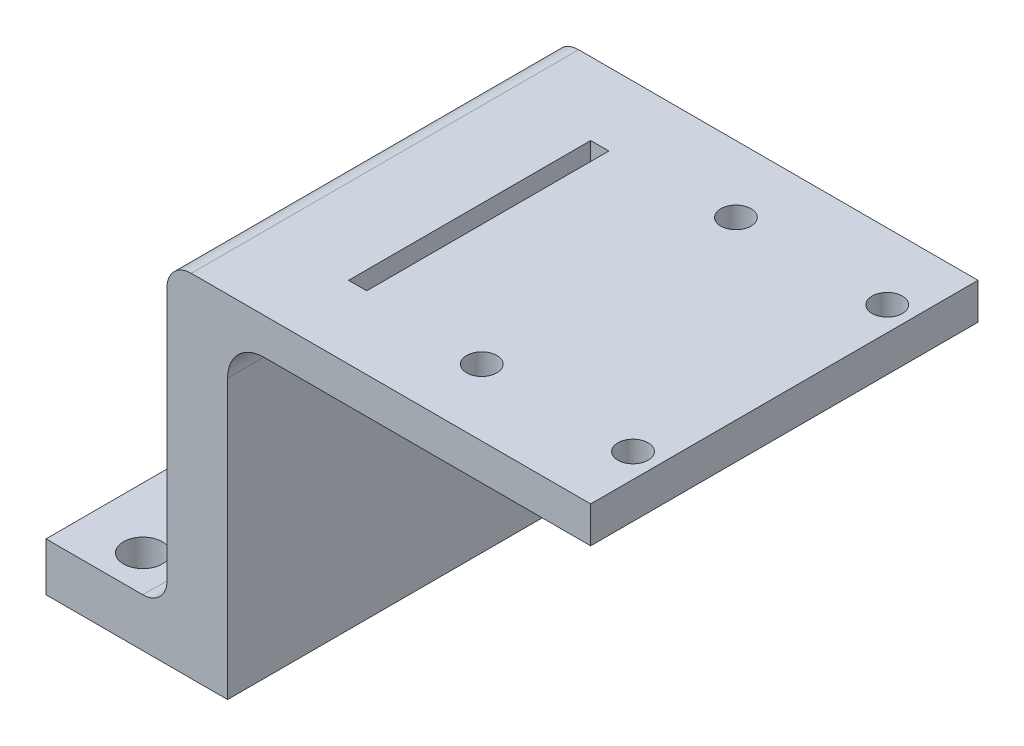
ISO-10303-21;
HEADER;
FILE_DESCRIPTION(('STEP AP214'),'2;1');
FILE_NAME('part.step','',(''),(''),'','','');
FILE_SCHEMA(('AUTOMOTIVE_DESIGN { 1 0 10303 214 1 1 1 1 }'));
ENDSEC;
DATA;
#1=APPLICATION_CONTEXT('core data for automotive mechanical design processes');
#2=APPLICATION_PROTOCOL_DEFINITION('international standard','automotive_design',2000,#1);
#3=PRODUCT_CONTEXT('',#1,'mechanical');
#4=PRODUCT('Part','Part','',(#3));
#5=PRODUCT_RELATED_PRODUCT_CATEGORY('part','',(#4));
#6=PRODUCT_DEFINITION_FORMATION('','',#4);
#7=PRODUCT_DEFINITION_CONTEXT('part definition',#1,'design');
#8=PRODUCT_DEFINITION('design','',#6,#7);
#9=PRODUCT_DEFINITION_SHAPE('','',#8);
#10=(LENGTH_UNIT() NAMED_UNIT(*) SI_UNIT(.MILLI.,.METRE.));
#11=(NAMED_UNIT(*) PLANE_ANGLE_UNIT() SI_UNIT($,.RADIAN.));
#12=(NAMED_UNIT(*) SI_UNIT($,.STERADIAN.) SOLID_ANGLE_UNIT());
#13=UNCERTAINTY_MEASURE_WITH_UNIT(LENGTH_MEASURE(1.E-05),#10,'distance_accuracy_value','');
#14=(GEOMETRIC_REPRESENTATION_CONTEXT(3) GLOBAL_UNCERTAINTY_ASSIGNED_CONTEXT((#13)) GLOBAL_UNIT_ASSIGNED_CONTEXT((#10,
#11,#12)) REPRESENTATION_CONTEXT('',''));
#15=CARTESIAN_POINT('',(0.,0.,0.));
#16=DIRECTION('',(0.,0.,1.));
#17=DIRECTION('',(1.,0.,0.));
#18=AXIS2_PLACEMENT_3D('',#15,#16,#17);
#19=CARTESIAN_POINT('',(0.,4.,0.));
#20=DIRECTION('',(0.,1.,0.));
#21=DIRECTION('',(0.,0.,1.));
#22=AXIS2_PLACEMENT_3D('',#19,#20,#21);
#23=PLANE('',#22);
#24=DIRECTION('',(1.,0.,0.));
#25=VECTOR('',#24,1.);
#26=CARTESIAN_POINT('',(-5.,4.,16.));
#27=LINE('',#26,#25);
#28=CARTESIAN_POINT('',(-5.,4.,16.));
#29=VERTEX_POINT('',#28);
#30=CARTESIAN_POINT('',(3.,4.,16.));
#31=VERTEX_POINT('',#30);
#32=EDGE_CURVE('E250',#29,#31,#27,.T.);
#33=ORIENTED_EDGE('',*,*,#32,.T.);
#34=DIRECTION('',(0.,0.,1.));
#35=VECTOR('',#34,1.);
#36=CARTESIAN_POINT('',(3.,4.,0.));
#37=LINE('',#36,#35);
#38=CARTESIAN_POINT('',(3.,4.,-16.));
#39=VERTEX_POINT('',#38);
#40=EDGE_CURVE('E267',#31,#39,#37,.F.);
#41=ORIENTED_EDGE('',*,*,#40,.T.);
#42=DIRECTION('',(-1.,0.,0.));
#43=VECTOR('',#42,1.);
#44=CARTESIAN_POINT('',(-5.,4.,-16.));
#45=LINE('',#44,#43);
#46=CARTESIAN_POINT('',(-5.,4.,-16.));
#47=VERTEX_POINT('',#46);
#48=EDGE_CURVE('E245',#39,#47,#45,.T.);
#49=ORIENTED_EDGE('',*,*,#48,.T.);
#50=DIRECTION('',(0.,0.,1.));
#51=VECTOR('',#50,1.);
#52=CARTESIAN_POINT('',(-5.,4.,-16.));
#53=LINE('',#52,#51);
#54=EDGE_CURVE('E247',#47,#29,#53,.T.);
#55=ORIENTED_EDGE('',*,*,#54,.T.);
#56=EDGE_LOOP('',(#33,#41,#49,#55));
#57=FACE_BOUND('',#56,.T.);
#58=CARTESIAN_POINT('',(0.,4.,13.));
#59=DIRECTION('',(0.,1.,0.));
#60=DIRECTION('',(0.,0.,1.));
#61=AXIS2_PLACEMENT_3D('',#58,#59,#60);
#62=CIRCLE('',#61,1.6);
#63=CARTESIAN_POINT('',(0.,4.,14.6));
#64=VERTEX_POINT('',#63);
#65=EDGE_CURVE('E239',#64,#64,#62,.T.);
#66=ORIENTED_EDGE('',*,*,#65,.F.);
#67=EDGE_LOOP('',(#66));
#68=FACE_BOUND('',#67,.T.);
#69=CARTESIAN_POINT('',(0.,4.,-13.));
#70=DIRECTION('',(0.,1.,0.));
#71=DIRECTION('',(0.,0.,1.));
#72=AXIS2_PLACEMENT_3D('',#69,#70,#71);
#73=CIRCLE('',#72,1.6);
#74=CARTESIAN_POINT('',(0.,4.,-11.4));
#75=VERTEX_POINT('',#74);
#76=EDGE_CURVE('E233',#75,#75,#73,.T.);
#77=ORIENTED_EDGE('',*,*,#76,.F.);
#78=EDGE_LOOP('',(#77));
#79=FACE_BOUND('',#78,.T.);
#80=ADVANCED_FACE('F41',(#57,#68,#79),#23,.T.);
#81=CARTESIAN_POINT('',(0.,0.,0.));
#82=DIRECTION('',(0.,1.,0.));
#83=DIRECTION('',(0.,0.,1.));
#84=AXIS2_PLACEMENT_3D('',#81,#82,#83);
#85=PLANE('',#84);
#86=DIRECTION('',(-1.,0.,0.));
#87=VECTOR('',#86,1.);
#88=CARTESIAN_POINT('',(-5.,0.,-16.));
#89=LINE('',#88,#87);
#90=CARTESIAN_POINT('',(10.,0.,-16.));
#91=VERTEX_POINT('',#90);
#92=CARTESIAN_POINT('',(-5.,0.,-16.));
#93=VERTEX_POINT('',#92);
#94=EDGE_CURVE('E242',#91,#93,#89,.T.);
#95=ORIENTED_EDGE('',*,*,#94,.F.);
#96=DIRECTION('',(0.,0.,-1.));
#97=VECTOR('',#96,1.);
#98=CARTESIAN_POINT('',(10.,0.,16.));
#99=LINE('',#98,#97);
#100=CARTESIAN_POINT('',(10.,0.,16.));
#101=VERTEX_POINT('',#100);
#102=EDGE_CURVE('E226',#101,#91,#99,.T.);
#103=ORIENTED_EDGE('',*,*,#102,.F.);
#104=DIRECTION('',(1.,0.,0.));
#105=VECTOR('',#104,1.);
#106=CARTESIAN_POINT('',(-5.,0.,16.));
#107=LINE('',#106,#105);
#108=CARTESIAN_POINT('',(-5.,0.,16.));
#109=VERTEX_POINT('',#108);
#110=EDGE_CURVE('E248',#109,#101,#107,.T.);
#111=ORIENTED_EDGE('',*,*,#110,.F.);
#112=DIRECTION('',(0.,0.,1.));
#113=VECTOR('',#112,1.);
#114=CARTESIAN_POINT('',(-5.,0.,-16.));
#115=LINE('',#114,#113);
#116=EDGE_CURVE('E255',#93,#109,#115,.T.);
#117=ORIENTED_EDGE('',*,*,#116,.F.);
#118=EDGE_LOOP('',(#95,#103,#111,#117));
#119=FACE_BOUND('',#118,.T.);
#120=CARTESIAN_POINT('',(0.,0.,13.));
#121=DIRECTION('',(0.,1.,0.));
#122=DIRECTION('',(0.,0.,1.));
#123=AXIS2_PLACEMENT_3D('',#120,#121,#122);
#124=CIRCLE('',#123,1.6);
#125=CARTESIAN_POINT('',(0.,0.,14.6));
#126=VERTEX_POINT('',#125);
#127=EDGE_CURVE('E236',#126,#126,#124,.T.);
#128=ORIENTED_EDGE('',*,*,#127,.T.);
#129=EDGE_LOOP('',(#128));
#130=FACE_BOUND('',#129,.T.);
#131=CARTESIAN_POINT('',(0.,0.,-13.));
#132=DIRECTION('',(0.,1.,0.));
#133=DIRECTION('',(0.,0.,1.));
#134=AXIS2_PLACEMENT_3D('',#131,#132,#133);
#135=CIRCLE('',#134,1.6);
#136=CARTESIAN_POINT('',(0.,0.,-11.4));
#137=VERTEX_POINT('',#136);
#138=EDGE_CURVE('E232',#137,#137,#135,.T.);
#139=ORIENTED_EDGE('',*,*,#138,.T.);
#140=EDGE_LOOP('',(#139));
#141=FACE_BOUND('',#140,.T.);
#142=ADVANCED_FACE('F348',(#119,#130,#141),#85,.F.);
#143=CARTESIAN_POINT('',(-5.,4.,-16.));
#144=DIRECTION('',(0.,0.,1.));
#145=DIRECTION('',(1.,0.,0.));
#146=AXIS2_PLACEMENT_3D('',#143,#144,#145);
#147=PLANE('',#146);
#148=DIRECTION('',(0.,-1.,0.));
#149=VECTOR('',#148,1.);
#150=CARTESIAN_POINT('',(5.,29.,-16.));
#151=LINE('',#150,#149);
#152=CARTESIAN_POINT('',(5.,27.,-16.));
#153=VERTEX_POINT('',#152);
#154=CARTESIAN_POINT('',(5.,6.,-16.));
#155=VERTEX_POINT('',#154);
#156=EDGE_CURVE('E222',#153,#155,#151,.T.);
#157=ORIENTED_EDGE('',*,*,#156,.F.);
#158=CARTESIAN_POINT('',(7.,27.,-16.));
#159=DIRECTION('',(0.,0.,1.));
#160=DIRECTION('',(1.,0.,0.));
#161=AXIS2_PLACEMENT_3D('',#158,#159,#160);
#162=CIRCLE('',#161,2.);
#163=CARTESIAN_POINT('',(7.,29.,-16.));
#164=VERTEX_POINT('',#163);
#165=EDGE_CURVE('E291',#153,#164,#162,.F.);
#166=ORIENTED_EDGE('',*,*,#165,.T.);
#167=DIRECTION('',(-1.,0.,0.));
#168=VECTOR('',#167,1.);
#169=CARTESIAN_POINT('',(10.,29.,-16.));
#170=LINE('',#169,#168);
#171=CARTESIAN_POINT('',(40.,29.,-16.));
#172=VERTEX_POINT('',#171);
#173=EDGE_CURVE('E215',#172,#164,#170,.T.);
#174=ORIENTED_EDGE('',*,*,#173,.F.);
#175=DIRECTION('',(0.,1.,0.));
#176=VECTOR('',#175,1.);
#177=CARTESIAN_POINT('',(40.,29.,-16.));
#178=LINE('',#177,#176);
#179=CARTESIAN_POINT('',(40.,26.,-16.));
#180=VERTEX_POINT('',#179);
#181=EDGE_CURVE('E203',#180,#172,#178,.T.);
#182=ORIENTED_EDGE('',*,*,#181,.F.);
#183=DIRECTION('',(-1.,0.,0.));
#184=VECTOR('',#183,1.);
#185=CARTESIAN_POINT('',(40.,26.,-16.));
#186=LINE('',#185,#184);
#187=CARTESIAN_POINT('',(13.,26.,-16.));
#188=VERTEX_POINT('',#187);
#189=EDGE_CURVE('E209',#180,#188,#186,.T.);
#190=ORIENTED_EDGE('',*,*,#189,.T.);
#191=CARTESIAN_POINT('',(13.,23.,-16.));
#192=DIRECTION('',(0.,0.,1.));
#193=DIRECTION('',(1.,0.,0.));
#194=AXIS2_PLACEMENT_3D('',#191,#192,#193);
#195=CIRCLE('',#194,3.);
#196=CARTESIAN_POINT('',(10.,23.,-16.));
#197=VERTEX_POINT('',#196);
#198=EDGE_CURVE('E49',#188,#197,#195,.T.);
#199=ORIENTED_EDGE('',*,*,#198,.T.);
#200=DIRECTION('',(0.,1.,0.));
#201=VECTOR('',#200,1.);
#202=CARTESIAN_POINT('',(10.,4.,-16.));
#203=LINE('',#202,#201);
#204=EDGE_CURVE('E229',#91,#197,#203,.T.);
#205=ORIENTED_EDGE('',*,*,#204,.F.);
#206=ORIENTED_EDGE('',*,*,#94,.T.);
#207=DIRECTION('',(0.,-1.,0.));
#208=VECTOR('',#207,1.);
#209=CARTESIAN_POINT('',(-5.,4.,-16.));
#210=LINE('',#209,#208);
#211=EDGE_CURVE('E261',#47,#93,#210,.T.);
#212=ORIENTED_EDGE('',*,*,#211,.F.);
#213=ORIENTED_EDGE('',*,*,#48,.F.);
#214=CARTESIAN_POINT('',(3.,6.,-16.));
#215=DIRECTION('',(0.,0.,1.));
#216=DIRECTION('',(1.,0.,0.));
#217=AXIS2_PLACEMENT_3D('',#214,#215,#216);
#218=CIRCLE('',#217,2.);
#219=EDGE_CURVE('E271',#39,#155,#218,.T.);
#220=ORIENTED_EDGE('',*,*,#219,.T.);
#221=EDGE_LOOP('',(#157,#166,#174,#182,#190,#199,#205,#206,#212,#213,#220));
#222=FACE_BOUND('',#221,.T.);
#223=ADVANCED_FACE('F300',(#222),#147,.F.);
#224=CARTESIAN_POINT('',(-5.,4.,-16.));
#225=DIRECTION('',(1.,0.,0.));
#226=DIRECTION('',(0.,0.,-1.));
#227=AXIS2_PLACEMENT_3D('',#224,#225,#226);
#228=PLANE('',#227);
#229=ORIENTED_EDGE('',*,*,#116,.T.);
#230=DIRECTION('',(0.,-1.,0.));
#231=VECTOR('',#230,1.);
#232=CARTESIAN_POINT('',(-5.,4.,16.));
#233=LINE('',#232,#231);
#234=EDGE_CURVE('E253',#29,#109,#233,.T.);
#235=ORIENTED_EDGE('',*,*,#234,.F.);
#236=ORIENTED_EDGE('',*,*,#54,.F.);
#237=ORIENTED_EDGE('',*,*,#211,.T.);
#238=EDGE_LOOP('',(#229,#235,#236,#237));
#239=FACE_BOUND('',#238,.T.);
#240=ADVANCED_FACE('F344',(#239),#228,.F.);
#241=CARTESIAN_POINT('',(-5.,4.,16.));
#242=DIRECTION('',(0.,0.,-1.));
#243=DIRECTION('',(-1.,0.,0.));
#244=AXIS2_PLACEMENT_3D('',#241,#242,#243);
#245=PLANE('',#244);
#246=DIRECTION('',(1.,0.,0.));
#247=VECTOR('',#246,1.);
#248=CARTESIAN_POINT('',(10.,29.,16.));
#249=LINE('',#248,#247);
#250=CARTESIAN_POINT('',(7.,29.,16.));
#251=VERTEX_POINT('',#250);
#252=CARTESIAN_POINT('',(40.,29.,16.));
#253=VERTEX_POINT('',#252);
#254=EDGE_CURVE('E218',#251,#253,#249,.T.);
#255=ORIENTED_EDGE('',*,*,#254,.F.);
#256=CARTESIAN_POINT('',(7.,27.,16.));
#257=DIRECTION('',(0.,0.,-1.));
#258=DIRECTION('',(-1.,0.,0.));
#259=AXIS2_PLACEMENT_3D('',#256,#257,#258);
#260=CIRCLE('',#259,2.);
#261=CARTESIAN_POINT('',(5.,27.,16.));
#262=VERTEX_POINT('',#261);
#263=EDGE_CURVE('E287',#251,#262,#260,.F.);
#264=ORIENTED_EDGE('',*,*,#263,.T.);
#265=DIRECTION('',(0.,-1.,0.));
#266=VECTOR('',#265,1.);
#267=CARTESIAN_POINT('',(5.,29.,16.));
#268=LINE('',#267,#266);
#269=CARTESIAN_POINT('',(5.,6.,16.));
#270=VERTEX_POINT('',#269);
#271=EDGE_CURVE('E220',#262,#270,#268,.T.);
#272=ORIENTED_EDGE('',*,*,#271,.T.);
#273=CARTESIAN_POINT('',(3.,6.,16.));
#274=DIRECTION('',(0.,0.,-1.));
#275=DIRECTION('',(-1.,0.,0.));
#276=AXIS2_PLACEMENT_3D('',#273,#274,#275);
#277=CIRCLE('',#276,2.);
#278=EDGE_CURVE('E269',#270,#31,#277,.T.);
#279=ORIENTED_EDGE('',*,*,#278,.T.);
#280=ORIENTED_EDGE('',*,*,#32,.F.);
#281=ORIENTED_EDGE('',*,*,#234,.T.);
#282=ORIENTED_EDGE('',*,*,#110,.T.);
#283=DIRECTION('',(0.,-1.,0.));
#284=VECTOR('',#283,1.);
#285=CARTESIAN_POINT('',(10.,4.,16.));
#286=LINE('',#285,#284);
#287=CARTESIAN_POINT('',(10.,23.,16.));
#288=VERTEX_POINT('',#287);
#289=EDGE_CURVE('E224',#288,#101,#286,.T.);
#290=ORIENTED_EDGE('',*,*,#289,.F.);
#291=CARTESIAN_POINT('',(13.,23.,16.));
#292=DIRECTION('',(0.,0.,-1.));
#293=DIRECTION('',(-1.,0.,0.));
#294=AXIS2_PLACEMENT_3D('',#291,#292,#293);
#295=CIRCLE('',#294,3.);
#296=CARTESIAN_POINT('',(13.,26.,16.));
#297=VERTEX_POINT('',#296);
#298=EDGE_CURVE('E11',#288,#297,#295,.T.);
#299=ORIENTED_EDGE('',*,*,#298,.T.);
#300=DIRECTION('',(-1.,0.,0.));
#301=VECTOR('',#300,1.);
#302=CARTESIAN_POINT('',(40.,26.,16.));
#303=LINE('',#302,#301);
#304=CARTESIAN_POINT('',(40.,26.,16.));
#305=VERTEX_POINT('',#304);
#306=EDGE_CURVE('E212',#305,#297,#303,.T.);
#307=ORIENTED_EDGE('',*,*,#306,.F.);
#308=DIRECTION('',(0.,-1.,0.));
#309=VECTOR('',#308,1.);
#310=CARTESIAN_POINT('',(40.,29.,16.));
#311=LINE('',#310,#309);
#312=EDGE_CURVE('E197',#253,#305,#311,.T.);
#313=ORIENTED_EDGE('',*,*,#312,.F.);
#314=EDGE_LOOP('',(#255,#264,#272,#279,#280,#281,#282,#290,#299,#307,#313));
#315=FACE_BOUND('',#314,.T.);
#316=ADVANCED_FACE('F314',(#315),#245,.F.);
#317=CARTESIAN_POINT('',(0.,4.,13.));
#318=DIRECTION('',(0.,-1.,0.));
#319=DIRECTION('',(0.,0.,-1.));
#320=AXIS2_PLACEMENT_3D('',#317,#318,#319);
#321=CYLINDRICAL_SURFACE('',#320,1.6);
#322=ORIENTED_EDGE('',*,*,#65,.T.);
#323=EDGE_LOOP('',(#322));
#324=FACE_BOUND('',#323,.T.);
#325=ORIENTED_EDGE('',*,*,#127,.F.);
#326=EDGE_LOOP('',(#325));
#327=FACE_BOUND('',#326,.T.);
#328=ADVANCED_FACE('F358',(#324,#327),#321,.F.);
#329=CARTESIAN_POINT('',(0.,4.,-13.));
#330=DIRECTION('',(0.,-1.,0.));
#331=DIRECTION('',(0.,0.,-1.));
#332=AXIS2_PLACEMENT_3D('',#329,#330,#331);
#333=CYLINDRICAL_SURFACE('',#332,1.6);
#334=ORIENTED_EDGE('',*,*,#76,.T.);
#335=EDGE_LOOP('',(#334));
#336=FACE_BOUND('',#335,.T.);
#337=ORIENTED_EDGE('',*,*,#138,.F.);
#338=EDGE_LOOP('',(#337));
#339=FACE_BOUND('',#338,.T.);
#340=ADVANCED_FACE('F356',(#336,#339),#333,.F.);
#341=CARTESIAN_POINT('',(10.,0.,0.));
#342=DIRECTION('',(1.,0.,0.));
#343=DIRECTION('',(0.,0.,-1.));
#344=AXIS2_PLACEMENT_3D('',#341,#342,#343);
#345=PLANE('',#344);
#346=ORIENTED_EDGE('',*,*,#204,.T.);
#347=DIRECTION('',(0.,0.,-1.));
#348=VECTOR('',#347,1.);
#349=CARTESIAN_POINT('',(10.,23.,0.));
#350=LINE('',#349,#348);
#351=EDGE_CURVE('E296',#197,#288,#350,.F.);
#352=ORIENTED_EDGE('',*,*,#351,.T.);
#353=ORIENTED_EDGE('',*,*,#289,.T.);
#354=ORIENTED_EDGE('',*,*,#102,.T.);
#355=EDGE_LOOP('',(#346,#352,#353,#354));
#356=FACE_BOUND('',#355,.T.);
#357=ADVANCED_FACE('F307',(#356),#345,.T.);
#358=CARTESIAN_POINT('',(5.,29.,-16.));
#359=DIRECTION('',(1.,0.,0.));
#360=DIRECTION('',(0.,0.,-1.));
#361=AXIS2_PLACEMENT_3D('',#358,#359,#360);
#362=PLANE('',#361);
#363=ORIENTED_EDGE('',*,*,#271,.F.);
#364=DIRECTION('',(0.,0.,1.));
#365=VECTOR('',#364,1.);
#366=CARTESIAN_POINT('',(5.,27.,-16.));
#367=LINE('',#366,#365);
#368=EDGE_CURVE('E289',#262,#153,#367,.F.);
#369=ORIENTED_EDGE('',*,*,#368,.T.);
#370=ORIENTED_EDGE('',*,*,#156,.T.);
#371=DIRECTION('',(0.,0.,1.));
#372=VECTOR('',#371,1.);
#373=CARTESIAN_POINT('',(5.,6.,-16.));
#374=LINE('',#373,#372);
#375=EDGE_CURVE('E264',#155,#270,#374,.T.);
#376=ORIENTED_EDGE('',*,*,#375,.T.);
#377=EDGE_LOOP('',(#363,#369,#370,#376));
#378=FACE_BOUND('',#377,.T.);
#379=ADVANCED_FACE('F329',(#378),#362,.F.);
#380=CARTESIAN_POINT('',(0.,29.,0.));
#381=DIRECTION('',(0.,-1.,0.));
#382=DIRECTION('',(0.,0.,-1.));
#383=AXIS2_PLACEMENT_3D('',#380,#381,#382);
#384=PLANE('',#383);
#385=DIRECTION('',(1.,0.,0.));
#386=VECTOR('',#385,1.);
#387=CARTESIAN_POINT('',(0.,29.,-10.));
#388=LINE('',#387,#386);
#389=CARTESIAN_POINT('',(14.,29.,-10.));
#390=VERTEX_POINT('',#389);
#391=CARTESIAN_POINT('',(15.5,29.,-10.));
#392=VERTEX_POINT('',#391);
#393=EDGE_CURVE('E178',#390,#392,#388,.T.);
#394=ORIENTED_EDGE('',*,*,#393,.T.);
#395=DIRECTION('',(0.,0.,1.));
#396=VECTOR('',#395,1.);
#397=CARTESIAN_POINT('',(15.5,29.,0.));
#398=LINE('',#397,#396);
#399=CARTESIAN_POINT('',(15.5,29.,10.));
#400=VERTEX_POINT('',#399);
#401=EDGE_CURVE('E181',#392,#400,#398,.T.);
#402=ORIENTED_EDGE('',*,*,#401,.T.);
#403=DIRECTION('',(-1.,0.,0.));
#404=VECTOR('',#403,1.);
#405=CARTESIAN_POINT('',(0.,29.,10.));
#406=LINE('',#405,#404);
#407=CARTESIAN_POINT('',(14.,29.,10.));
#408=VERTEX_POINT('',#407);
#409=EDGE_CURVE('E173',#400,#408,#406,.T.);
#410=ORIENTED_EDGE('',*,*,#409,.T.);
#411=DIRECTION('',(0.,0.,-1.));
#412=VECTOR('',#411,1.);
#413=CARTESIAN_POINT('',(14.,29.,0.));
#414=LINE('',#413,#412);
#415=EDGE_CURVE('E153',#408,#390,#414,.T.);
#416=ORIENTED_EDGE('',*,*,#415,.T.);
#417=EDGE_LOOP('',(#394,#402,#410,#416));
#418=FACE_BOUND('',#417,.T.);
#419=CARTESIAN_POINT('',(25.5,29.,10.5));
#420=DIRECTION('',(0.,1.,0.));
#421=DIRECTION('',(0.,0.,1.));
#422=AXIS2_PLACEMENT_3D('',#419,#420,#421);
#423=CIRCLE('',#422,1.25);
#424=CARTESIAN_POINT('',(25.5,29.,11.75));
#425=VERTEX_POINT('',#424);
#426=EDGE_CURVE('E184',#425,#425,#423,.T.);
#427=ORIENTED_EDGE('',*,*,#426,.F.);
#428=EDGE_LOOP('',(#427));
#429=FACE_BOUND('',#428,.T.);
#430=CARTESIAN_POINT('',(25.5,29.,-10.5));
#431=DIRECTION('',(0.,1.,0.));
#432=DIRECTION('',(0.,0.,1.));
#433=AXIS2_PLACEMENT_3D('',#430,#431,#432);
#434=CIRCLE('',#433,1.25);
#435=CARTESIAN_POINT('',(25.5,29.,-9.25));
#436=VERTEX_POINT('',#435);
#437=EDGE_CURVE('E189',#436,#436,#434,.T.);
#438=ORIENTED_EDGE('',*,*,#437,.F.);
#439=EDGE_LOOP('',(#438));
#440=FACE_BOUND('',#439,.T.);
#441=CARTESIAN_POINT('',(38.,29.,-10.5));
#442=DIRECTION('',(0.,1.,0.));
#443=DIRECTION('',(0.,0.,1.));
#444=AXIS2_PLACEMENT_3D('',#441,#442,#443);
#445=CIRCLE('',#444,1.25);
#446=CARTESIAN_POINT('',(38.,29.,-9.25));
#447=VERTEX_POINT('',#446);
#448=EDGE_CURVE('E185',#447,#447,#445,.T.);
#449=ORIENTED_EDGE('',*,*,#448,.F.);
#450=EDGE_LOOP('',(#449));
#451=FACE_BOUND('',#450,.T.);
#452=CARTESIAN_POINT('',(38.,29.,10.5));
#453=DIRECTION('',(0.,1.,0.));
#454=DIRECTION('',(0.,0.,1.));
#455=AXIS2_PLACEMENT_3D('',#452,#453,#454);
#456=CIRCLE('',#455,1.25);
#457=CARTESIAN_POINT('',(38.,29.,11.75));
#458=VERTEX_POINT('',#457);
#459=EDGE_CURVE('E188',#458,#458,#456,.T.);
#460=ORIENTED_EDGE('',*,*,#459,.F.);
#461=EDGE_LOOP('',(#460));
#462=FACE_BOUND('',#461,.T.);
#463=ORIENTED_EDGE('',*,*,#173,.T.);
#464=DIRECTION('',(0.,0.,1.));
#465=VECTOR('',#464,1.);
#466=CARTESIAN_POINT('',(7.,29.,0.));
#467=LINE('',#466,#465);
#468=EDGE_CURVE('E274',#164,#251,#467,.T.);
#469=ORIENTED_EDGE('',*,*,#468,.T.);
#470=ORIENTED_EDGE('',*,*,#254,.T.);
#471=DIRECTION('',(0.,0.,1.));
#472=VECTOR('',#471,1.);
#473=CARTESIAN_POINT('',(40.,29.,16.));
#474=LINE('',#473,#472);
#475=EDGE_CURVE('E206',#172,#253,#474,.T.);
#476=ORIENTED_EDGE('',*,*,#475,.F.);
#477=EDGE_LOOP('',(#463,#469,#470,#476));
#478=FACE_BOUND('',#477,.T.);
#479=ADVANCED_FACE('F322',(#418,#429,#440,#451,#462,#478),#384,.F.);
#480=CARTESIAN_POINT('',(3.,6.,-16.));
#481=DIRECTION('',(0.,0.,1.));
#482=DIRECTION('',(1.,0.,0.));
#483=AXIS2_PLACEMENT_3D('',#480,#481,#482);
#484=CYLINDRICAL_SURFACE('',#483,2.);
#485=ORIENTED_EDGE('',*,*,#219,.F.);
#486=ORIENTED_EDGE('',*,*,#40,.F.);
#487=ORIENTED_EDGE('',*,*,#278,.F.);
#488=ORIENTED_EDGE('',*,*,#375,.F.);
#489=EDGE_LOOP('',(#485,#486,#487,#488));
#490=FACE_BOUND('',#489,.T.);
#491=ADVANCED_FACE('F337',(#490),#484,.F.);
#492=CARTESIAN_POINT('',(40.,26.,16.));
#493=DIRECTION('',(0.,1.,0.));
#494=DIRECTION('',(0.,0.,1.));
#495=AXIS2_PLACEMENT_3D('',#492,#493,#494);
#496=PLANE('',#495);
#497=DIRECTION('',(-1.,0.,0.));
#498=VECTOR('',#497,1.);
#499=CARTESIAN_POINT('',(14.,26.,10.));
#500=LINE('',#499,#498);
#501=CARTESIAN_POINT('',(15.5,26.,10.));
#502=VERTEX_POINT('',#501);
#503=CARTESIAN_POINT('',(14.,26.,10.));
#504=VERTEX_POINT('',#503);
#505=EDGE_CURVE('E159',#502,#504,#500,.T.);
#506=ORIENTED_EDGE('',*,*,#505,.F.);
#507=DIRECTION('',(0.,0.,1.));
#508=VECTOR('',#507,1.);
#509=CARTESIAN_POINT('',(15.5,26.,10.));
#510=LINE('',#509,#508);
#511=CARTESIAN_POINT('',(15.5,26.,-10.));
#512=VERTEX_POINT('',#511);
#513=EDGE_CURVE('E64',#512,#502,#510,.T.);
#514=ORIENTED_EDGE('',*,*,#513,.F.);
#515=DIRECTION('',(1.,0.,0.));
#516=VECTOR('',#515,1.);
#517=CARTESIAN_POINT('',(14.,26.,-10.));
#518=LINE('',#517,#516);
#519=CARTESIAN_POINT('',(14.,26.,-10.));
#520=VERTEX_POINT('',#519);
#521=EDGE_CURVE('E166',#520,#512,#518,.T.);
#522=ORIENTED_EDGE('',*,*,#521,.F.);
#523=DIRECTION('',(0.,0.,-1.));
#524=VECTOR('',#523,1.);
#525=CARTESIAN_POINT('',(14.,26.,10.));
#526=LINE('',#525,#524);
#527=EDGE_CURVE('E150',#504,#520,#526,.T.);
#528=ORIENTED_EDGE('',*,*,#527,.F.);
#529=EDGE_LOOP('',(#506,#514,#522,#528));
#530=FACE_BOUND('',#529,.T.);
#531=CARTESIAN_POINT('',(25.5,26.,10.5));
#532=DIRECTION('',(0.,1.,0.));
#533=DIRECTION('',(0.,0.,1.));
#534=AXIS2_PLACEMENT_3D('',#531,#532,#533);
#535=CIRCLE('',#534,1.25);
#536=CARTESIAN_POINT('',(25.5,26.,11.75));
#537=VERTEX_POINT('',#536);
#538=EDGE_CURVE('E201',#537,#537,#535,.T.);
#539=ORIENTED_EDGE('',*,*,#538,.T.);
#540=EDGE_LOOP('',(#539));
#541=FACE_BOUND('',#540,.T.);
#542=CARTESIAN_POINT('',(25.5,26.,-10.5));
#543=DIRECTION('',(0.,1.,0.));
#544=DIRECTION('',(0.,0.,1.));
#545=AXIS2_PLACEMENT_3D('',#542,#543,#544);
#546=CIRCLE('',#545,1.25);
#547=CARTESIAN_POINT('',(25.5,26.,-9.25));
#548=VERTEX_POINT('',#547);
#549=EDGE_CURVE('E280',#548,#548,#546,.T.);
#550=ORIENTED_EDGE('',*,*,#549,.T.);
#551=EDGE_LOOP('',(#550));
#552=FACE_BOUND('',#551,.T.);
#553=CARTESIAN_POINT('',(38.,26.,-10.5));
#554=DIRECTION('',(0.,1.,0.));
#555=DIRECTION('',(0.,0.,1.));
#556=AXIS2_PLACEMENT_3D('',#553,#554,#555);
#557=CIRCLE('',#556,1.25);
#558=CARTESIAN_POINT('',(38.,26.,-9.25));
#559=VERTEX_POINT('',#558);
#560=EDGE_CURVE('E277',#559,#559,#557,.T.);
#561=ORIENTED_EDGE('',*,*,#560,.T.);
#562=EDGE_LOOP('',(#561));
#563=FACE_BOUND('',#562,.T.);
#564=CARTESIAN_POINT('',(38.,26.,10.5));
#565=DIRECTION('',(0.,1.,0.));
#566=DIRECTION('',(0.,0.,1.));
#567=AXIS2_PLACEMENT_3D('',#564,#565,#566);
#568=CIRCLE('',#567,1.25);
#569=CARTESIAN_POINT('',(38.,26.,11.75));
#570=VERTEX_POINT('',#569);
#571=EDGE_CURVE('E196',#570,#570,#568,.T.);
#572=ORIENTED_EDGE('',*,*,#571,.T.);
#573=EDGE_LOOP('',(#572));
#574=FACE_BOUND('',#573,.T.);
#575=ORIENTED_EDGE('',*,*,#306,.T.);
#576=DIRECTION('',(0.,0.,-1.));
#577=VECTOR('',#576,1.);
#578=CARTESIAN_POINT('',(13.,26.,16.));
#579=LINE('',#578,#577);
#580=EDGE_CURVE('E293',#297,#188,#579,.T.);
#581=ORIENTED_EDGE('',*,*,#580,.T.);
#582=ORIENTED_EDGE('',*,*,#189,.F.);
#583=DIRECTION('',(0.,0.,-1.));
#584=VECTOR('',#583,1.);
#585=CARTESIAN_POINT('',(40.,26.,16.));
#586=LINE('',#585,#584);
#587=EDGE_CURVE('E200',#305,#180,#586,.T.);
#588=ORIENTED_EDGE('',*,*,#587,.F.);
#589=EDGE_LOOP('',(#575,#581,#582,#588));
#590=FACE_BOUND('',#589,.T.);
#591=ADVANCED_FACE('F163',(#530,#541,#552,#563,#574,#590),#496,.F.);
#592=CARTESIAN_POINT('',(40.,0.,0.));
#593=DIRECTION('',(1.,0.,0.));
#594=DIRECTION('',(0.,0.,-1.));
#595=AXIS2_PLACEMENT_3D('',#592,#593,#594);
#596=PLANE('',#595);
#597=ORIENTED_EDGE('',*,*,#312,.T.);
#598=ORIENTED_EDGE('',*,*,#587,.T.);
#599=ORIENTED_EDGE('',*,*,#181,.T.);
#600=ORIENTED_EDGE('',*,*,#475,.T.);
#601=EDGE_LOOP('',(#597,#598,#599,#600));
#602=FACE_BOUND('',#601,.T.);
#603=ADVANCED_FACE('F318',(#602),#596,.T.);
#604=CARTESIAN_POINT('',(38.,4.,10.5));
#605=DIRECTION('',(0.,1.,0.));
#606=DIRECTION('',(0.,0.,1.));
#607=AXIS2_PLACEMENT_3D('',#604,#605,#606);
#608=CYLINDRICAL_SURFACE('',#607,1.25);
#609=ORIENTED_EDGE('',*,*,#459,.T.);
#610=EDGE_LOOP('',(#609));
#611=FACE_BOUND('',#610,.T.);
#612=ORIENTED_EDGE('',*,*,#571,.F.);
#613=EDGE_LOOP('',(#612));
#614=FACE_BOUND('',#613,.T.);
#615=ADVANCED_FACE('F400',(#611,#614),#608,.F.);
#616=CARTESIAN_POINT('',(38.,4.,-10.5));
#617=DIRECTION('',(0.,1.,0.));
#618=DIRECTION('',(0.,0.,1.));
#619=AXIS2_PLACEMENT_3D('',#616,#617,#618);
#620=CYLINDRICAL_SURFACE('',#619,1.25);
#621=ORIENTED_EDGE('',*,*,#448,.T.);
#622=EDGE_LOOP('',(#621));
#623=FACE_BOUND('',#622,.T.);
#624=ORIENTED_EDGE('',*,*,#560,.F.);
#625=EDGE_LOOP('',(#624));
#626=FACE_BOUND('',#625,.T.);
#627=ADVANCED_FACE('F394',(#623,#626),#620,.F.);
#628=CARTESIAN_POINT('',(25.5,4.,-10.5));
#629=DIRECTION('',(0.,1.,0.));
#630=DIRECTION('',(0.,0.,1.));
#631=AXIS2_PLACEMENT_3D('',#628,#629,#630);
#632=CYLINDRICAL_SURFACE('',#631,1.25);
#633=ORIENTED_EDGE('',*,*,#437,.T.);
#634=EDGE_LOOP('',(#633));
#635=FACE_BOUND('',#634,.T.);
#636=ORIENTED_EDGE('',*,*,#549,.F.);
#637=EDGE_LOOP('',(#636));
#638=FACE_BOUND('',#637,.T.);
#639=ADVANCED_FACE('F388',(#635,#638),#632,.F.);
#640=CARTESIAN_POINT('',(25.5,4.,10.5));
#641=DIRECTION('',(0.,1.,0.));
#642=DIRECTION('',(0.,0.,1.));
#643=AXIS2_PLACEMENT_3D('',#640,#641,#642);
#644=CYLINDRICAL_SURFACE('',#643,1.25);
#645=ORIENTED_EDGE('',*,*,#426,.T.);
#646=EDGE_LOOP('',(#645));
#647=FACE_BOUND('',#646,.T.);
#648=ORIENTED_EDGE('',*,*,#538,.F.);
#649=EDGE_LOOP('',(#648));
#650=FACE_BOUND('',#649,.T.);
#651=ADVANCED_FACE('F381',(#647,#650),#644,.F.);
#652=CARTESIAN_POINT('',(7.,27.,0.));
#653=DIRECTION('',(0.,0.,1.));
#654=DIRECTION('',(1.,0.,0.));
#655=AXIS2_PLACEMENT_3D('',#652,#653,#654);
#656=CYLINDRICAL_SURFACE('',#655,2.);
#657=ORIENTED_EDGE('',*,*,#165,.F.);
#658=ORIENTED_EDGE('',*,*,#368,.F.);
#659=ORIENTED_EDGE('',*,*,#263,.F.);
#660=ORIENTED_EDGE('',*,*,#468,.F.);
#661=EDGE_LOOP('',(#657,#658,#659,#660));
#662=FACE_BOUND('',#661,.T.);
#663=ADVANCED_FACE('F326',(#662),#656,.T.);
#664=CARTESIAN_POINT('',(13.,23.,16.));
#665=DIRECTION('',(0.,0.,-1.));
#666=DIRECTION('',(-1.,0.,0.));
#667=AXIS2_PLACEMENT_3D('',#664,#665,#666);
#668=CYLINDRICAL_SURFACE('',#667,3.);
#669=ORIENTED_EDGE('',*,*,#298,.F.);
#670=ORIENTED_EDGE('',*,*,#351,.F.);
#671=ORIENTED_EDGE('',*,*,#198,.F.);
#672=ORIENTED_EDGE('',*,*,#580,.F.);
#673=EDGE_LOOP('',(#669,#670,#671,#672));
#674=FACE_BOUND('',#673,.T.);
#675=ADVANCED_FACE('F43',(#674),#668,.F.);
#676=CARTESIAN_POINT('',(15.5,36.,10.));
#677=DIRECTION('',(1.,0.,0.));
#678=DIRECTION('',(0.,0.,-1.));
#679=AXIS2_PLACEMENT_3D('',#676,#677,#678);
#680=PLANE('',#679);
#681=DIRECTION('',(0.,-1.,0.));
#682=VECTOR('',#681,1.);
#683=CARTESIAN_POINT('',(15.5,36.,-10.));
#684=LINE('',#683,#682);
#685=EDGE_CURVE('E171',#392,#512,#684,.T.);
#686=ORIENTED_EDGE('',*,*,#685,.T.);
#687=ORIENTED_EDGE('',*,*,#513,.T.);
#688=DIRECTION('',(0.,-1.,0.));
#689=VECTOR('',#688,1.);
#690=CARTESIAN_POINT('',(15.5,36.,10.));
#691=LINE('',#690,#689);
#692=EDGE_CURVE('E156',#400,#502,#691,.T.);
#693=ORIENTED_EDGE('',*,*,#692,.F.);
#694=ORIENTED_EDGE('',*,*,#401,.F.);
#695=EDGE_LOOP('',(#686,#687,#693,#694));
#696=FACE_BOUND('',#695,.T.);
#697=ADVANCED_FACE('F386',(#696),#680,.F.);
#698=CARTESIAN_POINT('',(14.,36.,-10.));
#699=DIRECTION('',(0.,0.,-1.));
#700=DIRECTION('',(-1.,0.,0.));
#701=AXIS2_PLACEMENT_3D('',#698,#699,#700);
#702=PLANE('',#701);
#703=DIRECTION('',(0.,-1.,0.));
#704=VECTOR('',#703,1.);
#705=CARTESIAN_POINT('',(14.,36.,-10.));
#706=LINE('',#705,#704);
#707=EDGE_CURVE('E155',#390,#520,#706,.T.);
#708=ORIENTED_EDGE('',*,*,#707,.T.);
#709=ORIENTED_EDGE('',*,*,#521,.T.);
#710=ORIENTED_EDGE('',*,*,#685,.F.);
#711=ORIENTED_EDGE('',*,*,#393,.F.);
#712=EDGE_LOOP('',(#708,#709,#710,#711));
#713=FACE_BOUND('',#712,.T.);
#714=ADVANCED_FACE('F469',(#713),#702,.F.);
#715=CARTESIAN_POINT('',(14.,36.,10.));
#716=DIRECTION('',(-1.,0.,0.));
#717=DIRECTION('',(0.,0.,1.));
#718=AXIS2_PLACEMENT_3D('',#715,#716,#717);
#719=PLANE('',#718);
#720=DIRECTION('',(0.,-1.,0.));
#721=VECTOR('',#720,1.);
#722=CARTESIAN_POINT('',(14.,36.,10.));
#723=LINE('',#722,#721);
#724=EDGE_CURVE('E56',#408,#504,#723,.T.);
#725=ORIENTED_EDGE('',*,*,#724,.T.);
#726=ORIENTED_EDGE('',*,*,#527,.T.);
#727=ORIENTED_EDGE('',*,*,#707,.F.);
#728=ORIENTED_EDGE('',*,*,#415,.F.);
#729=EDGE_LOOP('',(#725,#726,#727,#728));
#730=FACE_BOUND('',#729,.T.);
#731=ADVANCED_FACE('F147',(#730),#719,.F.);
#732=CARTESIAN_POINT('',(14.,36.,10.));
#733=DIRECTION('',(0.,0.,1.));
#734=DIRECTION('',(1.,0.,0.));
#735=AXIS2_PLACEMENT_3D('',#732,#733,#734);
#736=PLANE('',#735);
#737=ORIENTED_EDGE('',*,*,#692,.T.);
#738=ORIENTED_EDGE('',*,*,#505,.T.);
#739=ORIENTED_EDGE('',*,*,#724,.F.);
#740=ORIENTED_EDGE('',*,*,#409,.F.);
#741=EDGE_LOOP('',(#737,#738,#739,#740));
#742=FACE_BOUND('',#741,.T.);
#743=ADVANCED_FACE('F160',(#742),#736,.F.);
#744=CLOSED_SHELL('',(#80,#142,#223,#240,#316,#328,#340,#357,#379,#479,#491,#591,#603,#615,#627,
#639,#651,#663,#675,#697,#714,#731,#743));
#745=MANIFOLD_SOLID_BREP('B2',#744);
#746=ADVANCED_BREP_SHAPE_REPRESENTATION('',(#18,#745),#14);
#747=SHAPE_DEFINITION_REPRESENTATION(#9,#746);
ENDSEC;
END-ISO-10303-21;
